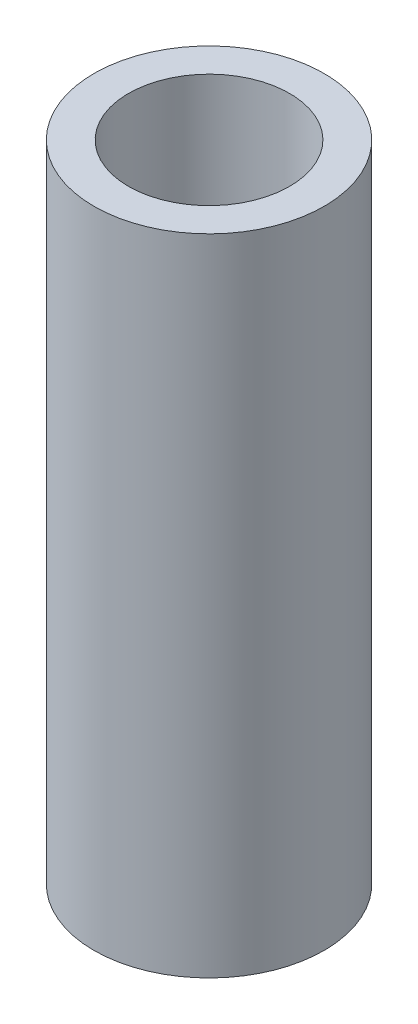
ISO-10303-21;
HEADER;
FILE_DESCRIPTION(('STEP AP214'),'2;1');
FILE_NAME('part.step','',(''),(''),'','','');
FILE_SCHEMA(('AUTOMOTIVE_DESIGN { 1 0 10303 214 1 1 1 1 }'));
ENDSEC;
DATA;
#1=APPLICATION_CONTEXT('core data for automotive mechanical design processes');
#2=APPLICATION_PROTOCOL_DEFINITION('international standard','automotive_design',2000,#1);
#3=PRODUCT_CONTEXT('',#1,'mechanical');
#4=PRODUCT('Part','Part','',(#3));
#5=PRODUCT_RELATED_PRODUCT_CATEGORY('part','',(#4));
#6=PRODUCT_DEFINITION_FORMATION('','',#4);
#7=PRODUCT_DEFINITION_CONTEXT('part definition',#1,'design');
#8=PRODUCT_DEFINITION('design','',#6,#7);
#9=PRODUCT_DEFINITION_SHAPE('','',#8);
#10=(LENGTH_UNIT() NAMED_UNIT(*) SI_UNIT(.MILLI.,.METRE.));
#11=(NAMED_UNIT(*) PLANE_ANGLE_UNIT() SI_UNIT($,.RADIAN.));
#12=(NAMED_UNIT(*) SI_UNIT($,.STERADIAN.) SOLID_ANGLE_UNIT());
#13=UNCERTAINTY_MEASURE_WITH_UNIT(LENGTH_MEASURE(1.E-05),#10,'distance_accuracy_value','');
#14=(GEOMETRIC_REPRESENTATION_CONTEXT(3) GLOBAL_UNCERTAINTY_ASSIGNED_CONTEXT((#13)) GLOBAL_UNIT_ASSIGNED_CONTEXT((#10,
#11,#12)) REPRESENTATION_CONTEXT('',''));
#15=CARTESIAN_POINT('',(0.,0.,0.));
#16=DIRECTION('',(0.,0.,1.));
#17=DIRECTION('',(1.,0.,0.));
#18=AXIS2_PLACEMENT_3D('',#15,#16,#17);
#19=CARTESIAN_POINT('',(0.,14.,0.));
#20=DIRECTION('',(0.,1.,0.));
#21=DIRECTION('',(0.,0.,1.));
#22=AXIS2_PLACEMENT_3D('',#19,#20,#21);
#23=PLANE('',#22);
#24=CARTESIAN_POINT('',(0.,14.,0.));
#25=DIRECTION('',(0.,1.,0.));
#26=DIRECTION('',(0.,0.,1.));
#27=AXIS2_PLACEMENT_3D('',#24,#25,#26);
#28=CIRCLE('',#27,2.5);
#29=CARTESIAN_POINT('',(0.,14.,2.5));
#30=VERTEX_POINT('',#29);
#31=EDGE_CURVE('E10',#30,#30,#28,.T.);
#32=ORIENTED_EDGE('',*,*,#31,.T.);
#33=EDGE_LOOP('',(#32));
#34=FACE_BOUND('',#33,.T.);
#35=CARTESIAN_POINT('',(0.,14.,0.));
#36=DIRECTION('',(0.,1.,0.));
#37=DIRECTION('',(0.,0.,1.));
#38=AXIS2_PLACEMENT_3D('',#35,#36,#37);
#39=CIRCLE('',#38,1.75);
#40=CARTESIAN_POINT('',(0.,14.,1.75));
#41=VERTEX_POINT('',#40);
#42=EDGE_CURVE('E44',#41,#41,#39,.T.);
#43=ORIENTED_EDGE('',*,*,#42,.F.);
#44=EDGE_LOOP('',(#43));
#45=FACE_BOUND('',#44,.T.);
#46=ADVANCED_FACE('F33',(#34,#45),#23,.T.);
#47=CARTESIAN_POINT('',(0.,0.,0.));
#48=DIRECTION('',(0.,1.,0.));
#49=DIRECTION('',(0.,0.,1.));
#50=AXIS2_PLACEMENT_3D('',#47,#48,#49);
#51=PLANE('',#50);
#52=CARTESIAN_POINT('',(0.,0.,0.));
#53=DIRECTION('',(0.,1.,0.));
#54=DIRECTION('',(0.,0.,1.));
#55=AXIS2_PLACEMENT_3D('',#52,#53,#54);
#56=CIRCLE('',#55,2.5);
#57=CARTESIAN_POINT('',(0.,0.,2.5));
#58=VERTEX_POINT('',#57);
#59=EDGE_CURVE('E37',#58,#58,#56,.T.);
#60=ORIENTED_EDGE('',*,*,#59,.F.);
#61=EDGE_LOOP('',(#60));
#62=FACE_BOUND('',#61,.T.);
#63=CARTESIAN_POINT('',(0.,0.,0.));
#64=DIRECTION('',(0.,1.,0.));
#65=DIRECTION('',(0.,0.,1.));
#66=AXIS2_PLACEMENT_3D('',#63,#64,#65);
#67=CIRCLE('',#66,1.75);
#68=CARTESIAN_POINT('',(0.,0.,1.75));
#69=VERTEX_POINT('',#68);
#70=EDGE_CURVE('E46',#69,#69,#67,.T.);
#71=ORIENTED_EDGE('',*,*,#70,.T.);
#72=EDGE_LOOP('',(#71));
#73=FACE_BOUND('',#72,.T.);
#74=ADVANCED_FACE('F56',(#62,#73),#51,.F.);
#75=CARTESIAN_POINT('',(0.,14.,0.));
#76=DIRECTION('',(0.,-1.,0.));
#77=DIRECTION('',(0.,0.,-1.));
#78=AXIS2_PLACEMENT_3D('',#75,#76,#77);
#79=CYLINDRICAL_SURFACE('',#78,2.5);
#80=ORIENTED_EDGE('',*,*,#31,.F.);
#81=EDGE_LOOP('',(#80));
#82=FACE_BOUND('',#81,.T.);
#83=ORIENTED_EDGE('',*,*,#59,.T.);
#84=EDGE_LOOP('',(#83));
#85=FACE_BOUND('',#84,.T.);
#86=ADVANCED_FACE('F35',(#82,#85),#79,.T.);
#87=CARTESIAN_POINT('',(0.,14.,0.));
#88=DIRECTION('',(0.,-1.,0.));
#89=DIRECTION('',(0.,0.,-1.));
#90=AXIS2_PLACEMENT_3D('',#87,#88,#89);
#91=CYLINDRICAL_SURFACE('',#90,1.75);
#92=ORIENTED_EDGE('',*,*,#42,.T.);
#93=EDGE_LOOP('',(#92));
#94=FACE_BOUND('',#93,.T.);
#95=ORIENTED_EDGE('',*,*,#70,.F.);
#96=EDGE_LOOP('',(#95));
#97=FACE_BOUND('',#96,.T.);
#98=ADVANCED_FACE('F52',(#94,#97),#91,.F.);
#99=CLOSED_SHELL('',(#46,#74,#86,#98));
#100=MANIFOLD_SOLID_BREP('B2',#99);
#101=ADVANCED_BREP_SHAPE_REPRESENTATION('',(#18,#100),#14);
#102=SHAPE_DEFINITION_REPRESENTATION(#9,#101);
ENDSEC;
END-ISO-10303-21;
